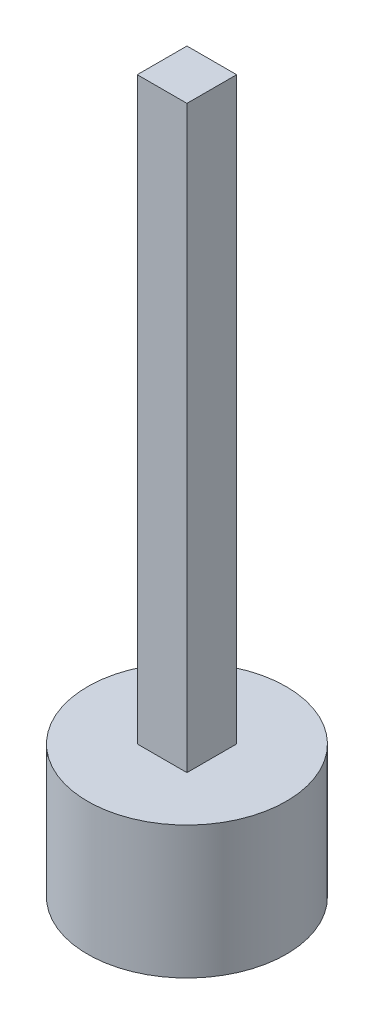
ISO-10303-21;
HEADER;
FILE_DESCRIPTION(('STEP AP214'),'2;1');
FILE_NAME('part.step','',(''),(''),'','','');
FILE_SCHEMA(('AUTOMOTIVE_DESIGN { 1 0 10303 214 1 1 1 1 }'));
ENDSEC;
DATA;
#1=APPLICATION_CONTEXT('core data for automotive mechanical design processes');
#2=APPLICATION_PROTOCOL_DEFINITION('international standard','automotive_design',2000,#1);
#3=PRODUCT_CONTEXT('',#1,'mechanical');
#4=PRODUCT('Part','Part','',(#3));
#5=PRODUCT_RELATED_PRODUCT_CATEGORY('part','',(#4));
#6=PRODUCT_DEFINITION_FORMATION('','',#4);
#7=PRODUCT_DEFINITION_CONTEXT('part definition',#1,'design');
#8=PRODUCT_DEFINITION('design','',#6,#7);
#9=PRODUCT_DEFINITION_SHAPE('','',#8);
#10=(LENGTH_UNIT() NAMED_UNIT(*) SI_UNIT(.MILLI.,.METRE.));
#11=(NAMED_UNIT(*) PLANE_ANGLE_UNIT() SI_UNIT($,.RADIAN.));
#12=(NAMED_UNIT(*) SI_UNIT($,.STERADIAN.) SOLID_ANGLE_UNIT());
#13=UNCERTAINTY_MEASURE_WITH_UNIT(LENGTH_MEASURE(1.E-05),#10,'distance_accuracy_value','');
#14=(GEOMETRIC_REPRESENTATION_CONTEXT(3) GLOBAL_UNCERTAINTY_ASSIGNED_CONTEXT((#13)) GLOBAL_UNIT_ASSIGNED_CONTEXT((#10,
#11,#12)) REPRESENTATION_CONTEXT('',''));
#15=CARTESIAN_POINT('',(0.,0.,0.));
#16=DIRECTION('',(0.,0.,1.));
#17=DIRECTION('',(1.,0.,0.));
#18=AXIS2_PLACEMENT_3D('',#15,#16,#17);
#19=CARTESIAN_POINT('',(15.,-350.,0.));
#20=DIRECTION('',(1.,0.,0.));
#21=DIRECTION('',(0.,0.,-1.));
#22=AXIS2_PLACEMENT_3D('',#19,#20,#21);
#23=PLANE('',#22);
#24=DIRECTION('',(0.,0.,-1.));
#25=VECTOR('',#24,1.);
#26=CARTESIAN_POINT('',(15.,0.,0.));
#27=LINE('',#26,#25);
#28=CARTESIAN_POINT('',(15.,0.,0.));
#29=VERTEX_POINT('',#28);
#30=CARTESIAN_POINT('',(15.,0.,-30.));
#31=VERTEX_POINT('',#30);
#32=EDGE_CURVE('E104',#29,#31,#27,.T.);
#33=ORIENTED_EDGE('',*,*,#32,.F.);
#34=DIRECTION('',(0.,1.,0.));
#35=VECTOR('',#34,1.);
#36=CARTESIAN_POINT('',(15.,-350.,0.));
#37=LINE('',#36,#35);
#38=CARTESIAN_POINT('',(15.,-350.,0.));
#39=VERTEX_POINT('',#38);
#40=EDGE_CURVE('E11',#39,#29,#37,.T.);
#41=ORIENTED_EDGE('',*,*,#40,.F.);
#42=DIRECTION('',(0.,0.,-1.));
#43=VECTOR('',#42,1.);
#44=CARTESIAN_POINT('',(15.,-350.,0.));
#45=LINE('',#44,#43);
#46=CARTESIAN_POINT('',(15.,-350.,-30.));
#47=VERTEX_POINT('',#46);
#48=EDGE_CURVE('E89',#39,#47,#45,.T.);
#49=ORIENTED_EDGE('',*,*,#48,.T.);
#50=DIRECTION('',(0.,1.,0.));
#51=VECTOR('',#50,1.);
#52=CARTESIAN_POINT('',(15.,-350.,-30.));
#53=LINE('',#52,#51);
#54=EDGE_CURVE('E38',#47,#31,#53,.T.);
#55=ORIENTED_EDGE('',*,*,#54,.T.);
#56=EDGE_LOOP('',(#33,#41,#49,#55));
#57=FACE_BOUND('',#56,.T.);
#58=ADVANCED_FACE('F35',(#57),#23,.T.);
#59=CARTESIAN_POINT('',(15.,-350.,0.));
#60=DIRECTION('',(0.,0.,1.));
#61=DIRECTION('',(1.,0.,0.));
#62=AXIS2_PLACEMENT_3D('',#59,#60,#61);
#63=PLANE('',#62);
#64=DIRECTION('',(1.,0.,0.));
#65=VECTOR('',#64,1.);
#66=CARTESIAN_POINT('',(15.,0.,0.));
#67=LINE('',#66,#65);
#68=CARTESIAN_POINT('',(-15.,0.,0.));
#69=VERTEX_POINT('',#68);
#70=EDGE_CURVE('E82',#69,#29,#67,.T.);
#71=ORIENTED_EDGE('',*,*,#70,.F.);
#72=DIRECTION('',(0.,1.,0.));
#73=VECTOR('',#72,1.);
#74=CARTESIAN_POINT('',(-15.,-350.,0.));
#75=LINE('',#74,#73);
#76=CARTESIAN_POINT('',(-15.,-350.,0.));
#77=VERTEX_POINT('',#76);
#78=EDGE_CURVE('E44',#77,#69,#75,.T.);
#79=ORIENTED_EDGE('',*,*,#78,.F.);
#80=DIRECTION('',(1.,0.,0.));
#81=VECTOR('',#80,1.);
#82=CARTESIAN_POINT('',(15.,-350.,0.));
#83=LINE('',#82,#81);
#84=EDGE_CURVE('E97',#77,#39,#83,.T.);
#85=ORIENTED_EDGE('',*,*,#84,.T.);
#86=ORIENTED_EDGE('',*,*,#40,.T.);
#87=EDGE_LOOP('',(#71,#79,#85,#86));
#88=FACE_BOUND('',#87,.T.);
#89=ADVANCED_FACE('F86',(#88),#63,.T.);
#90=CARTESIAN_POINT('',(-15.,-350.,0.));
#91=DIRECTION('',(-1.,0.,0.));
#92=DIRECTION('',(0.,0.,1.));
#93=AXIS2_PLACEMENT_3D('',#90,#91,#92);
#94=PLANE('',#93);
#95=DIRECTION('',(0.,0.,1.));
#96=VECTOR('',#95,1.);
#97=CARTESIAN_POINT('',(-15.,0.,0.));
#98=LINE('',#97,#96);
#99=CARTESIAN_POINT('',(-15.,0.,-30.));
#100=VERTEX_POINT('',#99);
#101=EDGE_CURVE('E70',#100,#69,#98,.T.);
#102=ORIENTED_EDGE('',*,*,#101,.F.);
#103=DIRECTION('',(0.,1.,0.));
#104=VECTOR('',#103,1.);
#105=CARTESIAN_POINT('',(-15.,-350.,-30.));
#106=LINE('',#105,#104);
#107=CARTESIAN_POINT('',(-15.,-350.,-30.));
#108=VERTEX_POINT('',#107);
#109=EDGE_CURVE('E76',#108,#100,#106,.T.);
#110=ORIENTED_EDGE('',*,*,#109,.F.);
#111=DIRECTION('',(0.,0.,1.));
#112=VECTOR('',#111,1.);
#113=CARTESIAN_POINT('',(-15.,-350.,0.));
#114=LINE('',#113,#112);
#115=EDGE_CURVE('E52',#108,#77,#114,.T.);
#116=ORIENTED_EDGE('',*,*,#115,.T.);
#117=ORIENTED_EDGE('',*,*,#78,.T.);
#118=EDGE_LOOP('',(#102,#110,#116,#117));
#119=FACE_BOUND('',#118,.T.);
#120=ADVANCED_FACE('F69',(#119),#94,.T.);
#121=CARTESIAN_POINT('',(15.,-350.,-30.));
#122=DIRECTION('',(0.,0.,-1.));
#123=DIRECTION('',(-1.,0.,0.));
#124=AXIS2_PLACEMENT_3D('',#121,#122,#123);
#125=PLANE('',#124);
#126=DIRECTION('',(-1.,0.,0.));
#127=VECTOR('',#126,1.);
#128=CARTESIAN_POINT('',(15.,0.,-30.));
#129=LINE('',#128,#127);
#130=EDGE_CURVE('E84',#31,#100,#129,.T.);
#131=ORIENTED_EDGE('',*,*,#130,.F.);
#132=ORIENTED_EDGE('',*,*,#54,.F.);
#133=DIRECTION('',(-1.,0.,0.));
#134=VECTOR('',#133,1.);
#135=CARTESIAN_POINT('',(15.,-350.,-30.));
#136=LINE('',#135,#134);
#137=EDGE_CURVE('E92',#47,#108,#136,.T.);
#138=ORIENTED_EDGE('',*,*,#137,.T.);
#139=ORIENTED_EDGE('',*,*,#109,.T.);
#140=EDGE_LOOP('',(#131,#132,#138,#139));
#141=FACE_BOUND('',#140,.T.);
#142=ADVANCED_FACE('F113',(#141),#125,.T.);
#143=CARTESIAN_POINT('',(0.,0.,0.));
#144=DIRECTION('',(0.,1.,0.));
#145=DIRECTION('',(0.,0.,1.));
#146=AXIS2_PLACEMENT_3D('',#143,#144,#145);
#147=PLANE('',#146);
#148=ORIENTED_EDGE('',*,*,#32,.T.);
#149=ORIENTED_EDGE('',*,*,#130,.T.);
#150=ORIENTED_EDGE('',*,*,#101,.T.);
#151=ORIENTED_EDGE('',*,*,#70,.T.);
#152=EDGE_LOOP('',(#148,#149,#150,#151));
#153=FACE_BOUND('',#152,.T.);
#154=ADVANCED_FACE('F81',(#153),#147,.T.);
#155=CARTESIAN_POINT('',(0.,-430.,-15.));
#156=DIRECTION('',(0.,1.,0.));
#157=DIRECTION('',(0.,0.,1.));
#158=AXIS2_PLACEMENT_3D('',#155,#156,#157);
#159=CYLINDRICAL_SURFACE('',#158,60.);
#160=CARTESIAN_POINT('',(0.,-430.,-15.));
#161=DIRECTION('',(0.,-1.,0.));
#162=DIRECTION('',(0.,0.,-1.));
#163=AXIS2_PLACEMENT_3D('',#160,#161,#162);
#164=CIRCLE('',#163,60.);
#165=CARTESIAN_POINT('',(0.,-430.,-75.));
#166=VERTEX_POINT('',#165);
#167=EDGE_CURVE('E105',#166,#166,#164,.T.);
#168=ORIENTED_EDGE('',*,*,#167,.F.);
#169=EDGE_LOOP('',(#168));
#170=FACE_BOUND('',#169,.T.);
#171=CARTESIAN_POINT('',(0.,-350.,-15.));
#172=DIRECTION('',(0.,-1.,0.));
#173=DIRECTION('',(0.,0.,-1.));
#174=AXIS2_PLACEMENT_3D('',#171,#172,#173);
#175=CIRCLE('',#174,60.);
#176=CARTESIAN_POINT('',(0.,-350.,-75.));
#177=VERTEX_POINT('',#176);
#178=EDGE_CURVE('E107',#177,#177,#175,.T.);
#179=ORIENTED_EDGE('',*,*,#178,.T.);
#180=EDGE_LOOP('',(#179));
#181=FACE_BOUND('',#180,.T.);
#182=ADVANCED_FACE('F134',(#170,#181),#159,.T.);
#183=CARTESIAN_POINT('',(0.,-430.,-15.));
#184=DIRECTION('',(0.,-1.,0.));
#185=DIRECTION('',(0.,0.,-1.));
#186=AXIS2_PLACEMENT_3D('',#183,#184,#185);
#187=PLANE('',#186);
#188=ORIENTED_EDGE('',*,*,#167,.T.);
#189=EDGE_LOOP('',(#188));
#190=FACE_BOUND('',#189,.T.);
#191=ADVANCED_FACE('F138',(#190),#187,.T.);
#192=CARTESIAN_POINT('',(0.,-350.,-15.));
#193=DIRECTION('',(0.,-1.,0.));
#194=DIRECTION('',(0.,0.,-1.));
#195=AXIS2_PLACEMENT_3D('',#192,#193,#194);
#196=PLANE('',#195);
#197=ORIENTED_EDGE('',*,*,#48,.F.);
#198=ORIENTED_EDGE('',*,*,#84,.F.);
#199=ORIENTED_EDGE('',*,*,#115,.F.);
#200=ORIENTED_EDGE('',*,*,#137,.F.);
#201=EDGE_LOOP('',(#197,#198,#199,#200));
#202=FACE_BOUND('',#201,.T.);
#203=ORIENTED_EDGE('',*,*,#178,.F.);
#204=EDGE_LOOP('',(#203));
#205=FACE_BOUND('',#204,.T.);
#206=ADVANCED_FACE('F116',(#202,#205),#196,.F.);
#207=CLOSED_SHELL('',(#58,#89,#120,#142,#154,#182,#191,#206));
#208=MANIFOLD_SOLID_BREP('B2',#207);
#209=ADVANCED_BREP_SHAPE_REPRESENTATION('',(#18,#208),#14);
#210=SHAPE_DEFINITION_REPRESENTATION(#9,#209);
ENDSEC;
END-ISO-10303-21;
